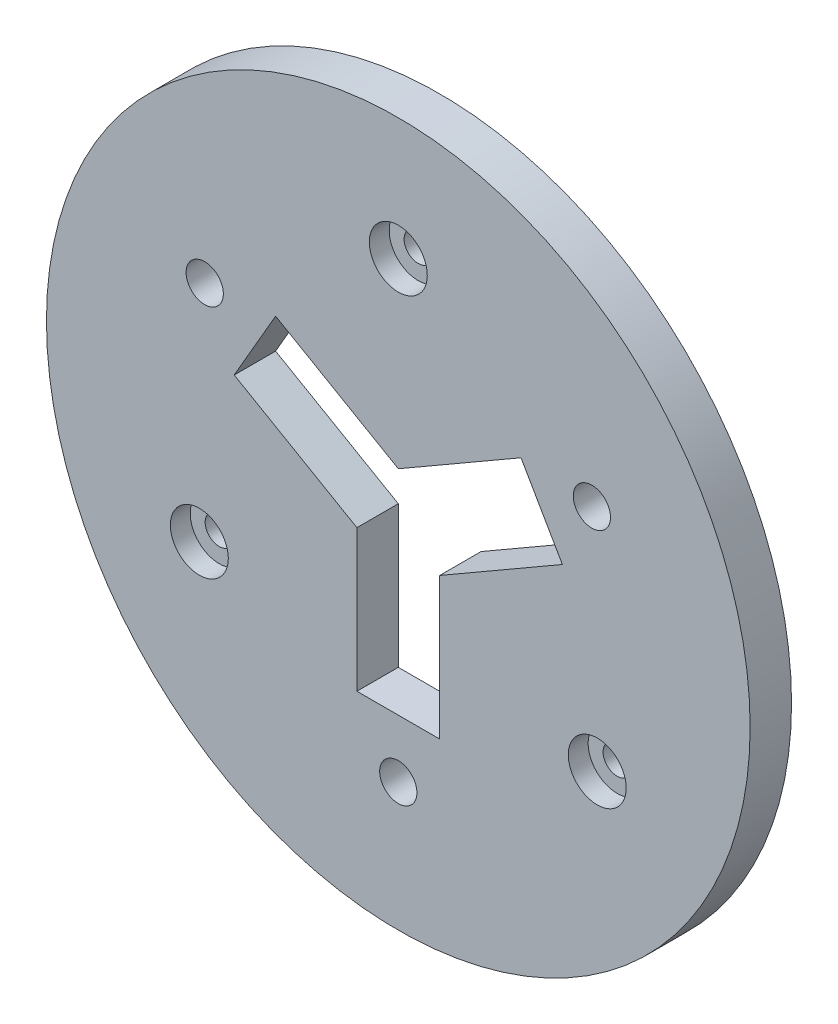
ISO-10303-21;
HEADER;
FILE_DESCRIPTION(('STEP AP214'),'2;1');
FILE_NAME('part.step','',(''),(''),'','','');
FILE_SCHEMA(('AUTOMOTIVE_DESIGN { 1 0 10303 214 1 1 1 1 }'));
ENDSEC;
DATA;
#1=APPLICATION_CONTEXT('core data for automotive mechanical design processes');
#2=APPLICATION_PROTOCOL_DEFINITION('international standard','automotive_design',2000,#1);
#3=PRODUCT_CONTEXT('',#1,'mechanical');
#4=PRODUCT('Part','Part','',(#3));
#5=PRODUCT_RELATED_PRODUCT_CATEGORY('part','',(#4));
#6=PRODUCT_DEFINITION_FORMATION('','',#4);
#7=PRODUCT_DEFINITION_CONTEXT('part definition',#1,'design');
#8=PRODUCT_DEFINITION('design','',#6,#7);
#9=PRODUCT_DEFINITION_SHAPE('','',#8);
#10=(LENGTH_UNIT() NAMED_UNIT(*) SI_UNIT(.MILLI.,.METRE.));
#11=(NAMED_UNIT(*) PLANE_ANGLE_UNIT() SI_UNIT($,.RADIAN.));
#12=(NAMED_UNIT(*) SI_UNIT($,.STERADIAN.) SOLID_ANGLE_UNIT());
#13=UNCERTAINTY_MEASURE_WITH_UNIT(LENGTH_MEASURE(1.E-05),#10,'distance_accuracy_value','');
#14=(GEOMETRIC_REPRESENTATION_CONTEXT(3) GLOBAL_UNCERTAINTY_ASSIGNED_CONTEXT((#13)) GLOBAL_UNIT_ASSIGNED_CONTEXT((#10,
#11,#12)) REPRESENTATION_CONTEXT('',''));
#15=CARTESIAN_POINT('',(0.,0.,0.));
#16=DIRECTION('',(0.,0.,1.));
#17=DIRECTION('',(1.,0.,0.));
#18=AXIS2_PLACEMENT_3D('',#15,#16,#17);
#19=CARTESIAN_POINT('',(0.,0.,2.5));
#20=DIRECTION('',(0.,0.,-1.));
#21=DIRECTION('',(-1.,0.,0.));
#22=AXIS2_PLACEMENT_3D('',#19,#20,#21);
#23=CYLINDRICAL_SURFACE('',#22,42.5);
#24=CARTESIAN_POINT('',(0.,0.,2.5));
#25=DIRECTION('',(0.,0.,1.));
#26=DIRECTION('',(1.,0.,0.));
#27=AXIS2_PLACEMENT_3D('',#24,#25,#26);
#28=CIRCLE('',#27,42.5);
#29=CARTESIAN_POINT('',(42.5,0.,2.5));
#30=VERTEX_POINT('',#29);
#31=EDGE_CURVE('E11',#30,#30,#28,.T.);
#32=ORIENTED_EDGE('',*,*,#31,.F.);
#33=EDGE_LOOP('',(#32));
#34=FACE_BOUND('',#33,.T.);
#35=CARTESIAN_POINT('',(0.,0.,-2.5));
#36=DIRECTION('',(0.,0.,1.));
#37=DIRECTION('',(1.,0.,0.));
#38=AXIS2_PLACEMENT_3D('',#35,#36,#37);
#39=CIRCLE('',#38,42.5);
#40=CARTESIAN_POINT('',(42.5,0.,-2.5));
#41=VERTEX_POINT('',#40);
#42=EDGE_CURVE('E36',#41,#41,#39,.T.);
#43=ORIENTED_EDGE('',*,*,#42,.T.);
#44=EDGE_LOOP('',(#43));
#45=FACE_BOUND('',#44,.T.);
#46=ADVANCED_FACE('F33',(#34,#45),#23,.T.);
#47=CARTESIAN_POINT('',(0.,0.,2.5));
#48=DIRECTION('',(0.,0.,1.));
#49=DIRECTION('',(1.,0.,0.));
#50=AXIS2_PLACEMENT_3D('',#47,#48,#49);
#51=PLANE('',#50);
#52=DIRECTION('',(-0.499999999999998,-0.86602540378444,0.));
#53=VECTOR('',#52,1.);
#54=CARTESIAN_POINT('',(-14.8205080756888,14.3301270189222,2.5));
#55=LINE('',#54,#53);
#56=CARTESIAN_POINT('',(-14.8205080756888,14.3301270189222,2.5));
#57=VERTEX_POINT('',#56);
#58=CARTESIAN_POINT('',(-19.8205080756888,5.66987298107775,2.5));
#59=VERTEX_POINT('',#58);
#60=EDGE_CURVE('E47',#57,#59,#55,.T.);
#61=ORIENTED_EDGE('',*,*,#60,.F.);
#62=DIRECTION('',(-0.86602540378444,0.499999999999998,0.));
#63=VECTOR('',#62,1.);
#64=CARTESIAN_POINT('',(-14.8205080756888,14.3301270189222,2.5));
#65=LINE('',#64,#63);
#66=CARTESIAN_POINT('',(0.,5.77350269189626,2.5));
#67=VERTEX_POINT('',#66);
#68=EDGE_CURVE('E111',#67,#57,#65,.T.);
#69=ORIENTED_EDGE('',*,*,#68,.F.);
#70=DIRECTION('',(-0.866025403784436,-0.500000000000004,0.));
#71=VECTOR('',#70,1.);
#72=CARTESIAN_POINT('',(0.,5.77350269189626,2.5));
#73=LINE('',#72,#71);
#74=CARTESIAN_POINT('',(14.8205080756887,14.3301270189223,2.5));
#75=VERTEX_POINT('',#74);
#76=EDGE_CURVE('E148',#75,#67,#73,.T.);
#77=ORIENTED_EDGE('',*,*,#76,.F.);
#78=DIRECTION('',(-0.500000000000004,0.866025403784436,0.));
#79=VECTOR('',#78,1.);
#80=CARTESIAN_POINT('',(14.8205080756887,14.3301270189223,2.5));
#81=LINE('',#80,#79);
#82=CARTESIAN_POINT('',(19.8205080756887,5.66987298107791,2.5));
#83=VERTEX_POINT('',#82);
#84=EDGE_CURVE('E145',#83,#75,#81,.T.);
#85=ORIENTED_EDGE('',*,*,#84,.F.);
#86=DIRECTION('',(0.866025403784436,0.500000000000004,0.));
#87=VECTOR('',#86,1.);
#88=CARTESIAN_POINT('',(5.,-2.88675134594811,2.5));
#89=LINE('',#88,#87);
#90=CARTESIAN_POINT('',(5.,-2.88675134594811,2.5));
#91=VERTEX_POINT('',#90);
#92=EDGE_CURVE('E142',#91,#83,#89,.T.);
#93=ORIENTED_EDGE('',*,*,#92,.F.);
#94=DIRECTION('',(0.,1.,0.));
#95=VECTOR('',#94,1.);
#96=CARTESIAN_POINT('',(5.,-2.88675134594811,2.5));
#97=LINE('',#96,#95);
#98=CARTESIAN_POINT('',(5.,-20.,2.5));
#99=VERTEX_POINT('',#98);
#100=EDGE_CURVE('E139',#99,#91,#97,.T.);
#101=ORIENTED_EDGE('',*,*,#100,.F.);
#102=DIRECTION('',(1.,0.,0.));
#103=VECTOR('',#102,1.);
#104=CARTESIAN_POINT('',(-5.,-20.,2.5));
#105=LINE('',#104,#103);
#106=CARTESIAN_POINT('',(-5.,-20.,2.5));
#107=VERTEX_POINT('',#106);
#108=EDGE_CURVE('E136',#107,#99,#105,.T.);
#109=ORIENTED_EDGE('',*,*,#108,.F.);
#110=DIRECTION('',(0.,-1.,0.));
#111=VECTOR('',#110,1.);
#112=CARTESIAN_POINT('',(-5.,-2.88675134594813,2.5));
#113=LINE('',#112,#111);
#114=CARTESIAN_POINT('',(-5.,-2.88675134594813,2.5));
#115=VERTEX_POINT('',#114);
#116=EDGE_CURVE('E133',#115,#107,#113,.T.);
#117=ORIENTED_EDGE('',*,*,#116,.F.);
#118=DIRECTION('',(0.86602540378444,-0.499999999999998,0.));
#119=VECTOR('',#118,1.);
#120=CARTESIAN_POINT('',(-19.8205080756888,5.66987298107775,2.5));
#121=LINE('',#120,#119);
#122=EDGE_CURVE('E126',#59,#115,#121,.T.);
#123=ORIENTED_EDGE('',*,*,#122,.F.);
#124=EDGE_LOOP('',(#61,#69,#77,#85,#93,#101,#109,#117,#123));
#125=FACE_BOUND('',#124,.T.);
#126=CARTESIAN_POINT('',(0.,-27.,2.5));
#127=DIRECTION('',(0.,0.,1.));
#128=DIRECTION('',(1.,0.,0.));
#129=AXIS2_PLACEMENT_3D('',#126,#127,#128);
#130=CIRCLE('',#129,2.25);
#131=CARTESIAN_POINT('',(2.25,-27.,2.5));
#132=VERTEX_POINT('',#131);
#133=EDGE_CURVE('E117',#132,#132,#130,.T.);
#134=ORIENTED_EDGE('',*,*,#133,.F.);
#135=EDGE_LOOP('',(#134));
#136=FACE_BOUND('',#135,.T.);
#137=CARTESIAN_POINT('',(-23.3826859021798,13.5,2.5));
#138=DIRECTION('',(0.,0.,1.));
#139=DIRECTION('',(1.,0.,0.));
#140=AXIS2_PLACEMENT_3D('',#137,#138,#139);
#141=CIRCLE('',#140,2.25);
#142=CARTESIAN_POINT('',(-21.1326859021798,13.5,2.5));
#143=VERTEX_POINT('',#142);
#144=EDGE_CURVE('E172',#143,#143,#141,.T.);
#145=ORIENTED_EDGE('',*,*,#144,.F.);
#146=EDGE_LOOP('',(#145));
#147=FACE_BOUND('',#146,.T.);
#148=CARTESIAN_POINT('',(23.3826859021799,13.5,2.5));
#149=DIRECTION('',(0.,0.,1.));
#150=DIRECTION('',(1.,0.,0.));
#151=AXIS2_PLACEMENT_3D('',#148,#149,#150);
#152=CIRCLE('',#151,2.25);
#153=CARTESIAN_POINT('',(25.6326859021799,13.5,2.5));
#154=VERTEX_POINT('',#153);
#155=EDGE_CURVE('E178',#154,#154,#152,.T.);
#156=ORIENTED_EDGE('',*,*,#155,.F.);
#157=EDGE_LOOP('',(#156));
#158=FACE_BOUND('',#157,.T.);
#159=CARTESIAN_POINT('',(0.,27.75,2.5));
#160=DIRECTION('',(0.,0.,1.));
#161=DIRECTION('',(1.,0.,0.));
#162=AXIS2_PLACEMENT_3D('',#159,#160,#161);
#163=CIRCLE('',#162,3.5);
#164=CARTESIAN_POINT('',(3.5,27.75,2.5));
#165=VERTEX_POINT('',#164);
#166=EDGE_CURVE('E184',#165,#165,#163,.T.);
#167=ORIENTED_EDGE('',*,*,#166,.F.);
#168=EDGE_LOOP('',(#167));
#169=FACE_BOUND('',#168,.T.);
#170=CARTESIAN_POINT('',(24.0322049550199,-13.874999999999,2.5));
#171=DIRECTION('',(0.,0.,1.));
#172=DIRECTION('',(1.,0.,0.));
#173=AXIS2_PLACEMENT_3D('',#170,#171,#172);
#174=CIRCLE('',#173,3.5);
#175=CARTESIAN_POINT('',(27.5322049550199,-13.874999999999,2.5));
#176=VERTEX_POINT('',#175);
#177=EDGE_CURVE('E196',#176,#176,#174,.T.);
#178=ORIENTED_EDGE('',*,*,#177,.F.);
#179=EDGE_LOOP('',(#178));
#180=FACE_BOUND('',#179,.T.);
#181=CARTESIAN_POINT('',(-24.0322049550165,-13.875000000001,2.5));
#182=DIRECTION('',(0.,0.,1.));
#183=DIRECTION('',(1.,0.,0.));
#184=AXIS2_PLACEMENT_3D('',#181,#182,#183);
#185=CIRCLE('',#184,3.5);
#186=CARTESIAN_POINT('',(-20.5322049550165,-13.875000000001,2.5));
#187=VERTEX_POINT('',#186);
#188=EDGE_CURVE('E208',#187,#187,#185,.T.);
#189=ORIENTED_EDGE('',*,*,#188,.F.);
#190=EDGE_LOOP('',(#189));
#191=FACE_BOUND('',#190,.T.);
#192=ORIENTED_EDGE('',*,*,#31,.T.);
#193=EDGE_LOOP('',(#192));
#194=FACE_BOUND('',#193,.T.);
#195=ADVANCED_FACE('F227',(#125,#136,#147,#158,#169,#180,#191,#194),#51,.T.);
#196=CARTESIAN_POINT('',(0.,0.,-2.5));
#197=DIRECTION('',(0.,0.,1.));
#198=DIRECTION('',(1.,0.,0.));
#199=AXIS2_PLACEMENT_3D('',#196,#197,#198);
#200=PLANE('',#199);
#201=DIRECTION('',(0.86602540378444,-0.499999999999998,0.));
#202=VECTOR('',#201,1.);
#203=CARTESIAN_POINT('',(-14.8205080756888,14.3301270189222,-2.5));
#204=LINE('',#203,#202);
#205=CARTESIAN_POINT('',(-14.8205080756888,14.3301270189222,-2.5));
#206=VERTEX_POINT('',#205);
#207=CARTESIAN_POINT('',(0.,5.77350269189626,-2.5));
#208=VERTEX_POINT('',#207);
#209=EDGE_CURVE('E124',#206,#208,#204,.T.);
#210=ORIENTED_EDGE('',*,*,#209,.F.);
#211=DIRECTION('',(0.499999999999998,0.86602540378444,0.));
#212=VECTOR('',#211,1.);
#213=CARTESIAN_POINT('',(-14.8205080756888,14.3301270189222,-2.5));
#214=LINE('',#213,#212);
#215=CARTESIAN_POINT('',(-19.8205080756888,5.66987298107775,-2.5));
#216=VERTEX_POINT('',#215);
#217=EDGE_CURVE('E105',#216,#206,#214,.T.);
#218=ORIENTED_EDGE('',*,*,#217,.F.);
#219=DIRECTION('',(-0.86602540378444,0.499999999999998,0.));
#220=VECTOR('',#219,1.);
#221=CARTESIAN_POINT('',(-19.8205080756888,5.66987298107775,-2.5));
#222=LINE('',#221,#220);
#223=CARTESIAN_POINT('',(-5.,-2.88675134594813,-2.5));
#224=VERTEX_POINT('',#223);
#225=EDGE_CURVE('E114',#224,#216,#222,.T.);
#226=ORIENTED_EDGE('',*,*,#225,.F.);
#227=DIRECTION('',(0.,1.,0.));
#228=VECTOR('',#227,1.);
#229=CARTESIAN_POINT('',(-5.,-2.88675134594813,-2.5));
#230=LINE('',#229,#228);
#231=CARTESIAN_POINT('',(-5.,-20.,-2.5));
#232=VERTEX_POINT('',#231);
#233=EDGE_CURVE('E55',#232,#224,#230,.T.);
#234=ORIENTED_EDGE('',*,*,#233,.F.);
#235=DIRECTION('',(-1.,0.,0.));
#236=VECTOR('',#235,1.);
#237=CARTESIAN_POINT('',(-5.,-20.,-2.5));
#238=LINE('',#237,#236);
#239=CARTESIAN_POINT('',(5.,-20.,-2.5));
#240=VERTEX_POINT('',#239);
#241=EDGE_CURVE('E496',#240,#232,#238,.T.);
#242=ORIENTED_EDGE('',*,*,#241,.F.);
#243=DIRECTION('',(0.,-1.,0.));
#244=VECTOR('',#243,1.);
#245=CARTESIAN_POINT('',(5.,-2.88675134594811,-2.5));
#246=LINE('',#245,#244);
#247=CARTESIAN_POINT('',(5.,-2.88675134594811,-2.5));
#248=VERTEX_POINT('',#247);
#249=EDGE_CURVE('E499',#248,#240,#246,.T.);
#250=ORIENTED_EDGE('',*,*,#249,.F.);
#251=DIRECTION('',(-0.866025403784436,-0.500000000000004,0.));
#252=VECTOR('',#251,1.);
#253=CARTESIAN_POINT('',(5.,-2.88675134594811,-2.5));
#254=LINE('',#253,#252);
#255=CARTESIAN_POINT('',(19.8205080756887,5.66987298107791,-2.5));
#256=VERTEX_POINT('',#255);
#257=EDGE_CURVE('E504',#256,#248,#254,.T.);
#258=ORIENTED_EDGE('',*,*,#257,.F.);
#259=DIRECTION('',(0.500000000000004,-0.866025403784436,0.));
#260=VECTOR('',#259,1.);
#261=CARTESIAN_POINT('',(14.8205080756887,14.3301270189223,-2.5));
#262=LINE('',#261,#260);
#263=CARTESIAN_POINT('',(14.8205080756887,14.3301270189223,-2.5));
#264=VERTEX_POINT('',#263);
#265=EDGE_CURVE('E507',#264,#256,#262,.T.);
#266=ORIENTED_EDGE('',*,*,#265,.F.);
#267=DIRECTION('',(0.866025403784436,0.500000000000004,0.));
#268=VECTOR('',#267,1.);
#269=CARTESIAN_POINT('',(0.,5.77350269189626,-2.5));
#270=LINE('',#269,#268);
#271=EDGE_CURVE('E128',#208,#264,#270,.T.);
#272=ORIENTED_EDGE('',*,*,#271,.F.);
#273=EDGE_LOOP('',(#210,#218,#226,#234,#242,#250,#258,#266,#272));
#274=FACE_BOUND('',#273,.T.);
#275=CARTESIAN_POINT('',(0.,-27.,-2.5));
#276=DIRECTION('',(0.,0.,1.));
#277=DIRECTION('',(1.,0.,0.));
#278=AXIS2_PLACEMENT_3D('',#275,#276,#277);
#279=CIRCLE('',#278,2.25);
#280=CARTESIAN_POINT('',(2.25,-27.,-2.5));
#281=VERTEX_POINT('',#280);
#282=EDGE_CURVE('E169',#281,#281,#279,.T.);
#283=ORIENTED_EDGE('',*,*,#282,.T.);
#284=EDGE_LOOP('',(#283));
#285=FACE_BOUND('',#284,.T.);
#286=CARTESIAN_POINT('',(-23.3826859021798,13.5,-2.5));
#287=DIRECTION('',(0.,0.,1.));
#288=DIRECTION('',(1.,0.,0.));
#289=AXIS2_PLACEMENT_3D('',#286,#287,#288);
#290=CIRCLE('',#289,2.25);
#291=CARTESIAN_POINT('',(-21.1326859021798,13.5,-2.5));
#292=VERTEX_POINT('',#291);
#293=EDGE_CURVE('E175',#292,#292,#290,.T.);
#294=ORIENTED_EDGE('',*,*,#293,.T.);
#295=EDGE_LOOP('',(#294));
#296=FACE_BOUND('',#295,.T.);
#297=CARTESIAN_POINT('',(23.3826859021799,13.5,-2.5));
#298=DIRECTION('',(0.,0.,1.));
#299=DIRECTION('',(1.,0.,0.));
#300=AXIS2_PLACEMENT_3D('',#297,#298,#299);
#301=CIRCLE('',#300,2.25);
#302=CARTESIAN_POINT('',(25.6326859021799,13.5,-2.5));
#303=VERTEX_POINT('',#302);
#304=EDGE_CURVE('E181',#303,#303,#301,.T.);
#305=ORIENTED_EDGE('',*,*,#304,.T.);
#306=EDGE_LOOP('',(#305));
#307=FACE_BOUND('',#306,.T.);
#308=CARTESIAN_POINT('',(0.,27.75,-2.5));
#309=DIRECTION('',(0.,0.,1.));
#310=DIRECTION('',(1.,0.,0.));
#311=AXIS2_PLACEMENT_3D('',#308,#309,#310);
#312=CIRCLE('',#311,1.7);
#313=CARTESIAN_POINT('',(1.7,27.75,-2.5));
#314=VERTEX_POINT('',#313);
#315=EDGE_CURVE('E193',#314,#314,#312,.T.);
#316=ORIENTED_EDGE('',*,*,#315,.T.);
#317=EDGE_LOOP('',(#316));
#318=FACE_BOUND('',#317,.T.);
#319=CARTESIAN_POINT('',(24.0322049550199,-13.874999999999,-2.5));
#320=DIRECTION('',(0.,0.,1.));
#321=DIRECTION('',(1.,0.,0.));
#322=AXIS2_PLACEMENT_3D('',#319,#320,#321);
#323=CIRCLE('',#322,1.7);
#324=CARTESIAN_POINT('',(25.7322049550199,-13.874999999999,-2.5));
#325=VERTEX_POINT('',#324);
#326=EDGE_CURVE('E205',#325,#325,#323,.T.);
#327=ORIENTED_EDGE('',*,*,#326,.T.);
#328=EDGE_LOOP('',(#327));
#329=FACE_BOUND('',#328,.T.);
#330=CARTESIAN_POINT('',(-24.0322049550165,-13.875000000001,-2.5));
#331=DIRECTION('',(0.,0.,1.));
#332=DIRECTION('',(1.,0.,0.));
#333=AXIS2_PLACEMENT_3D('',#330,#331,#332);
#334=CIRCLE('',#333,1.7);
#335=CARTESIAN_POINT('',(-22.3322049550165,-13.875000000001,-2.5));
#336=VERTEX_POINT('',#335);
#337=EDGE_CURVE('E217',#336,#336,#334,.T.);
#338=ORIENTED_EDGE('',*,*,#337,.T.);
#339=EDGE_LOOP('',(#338));
#340=FACE_BOUND('',#339,.T.);
#341=ORIENTED_EDGE('',*,*,#42,.F.);
#342=EDGE_LOOP('',(#341));
#343=FACE_BOUND('',#342,.T.);
#344=ADVANCED_FACE('F120',(#274,#285,#296,#307,#318,#329,#340,#343),#200,.F.);
#345=CARTESIAN_POINT('',(-24.0322049550165,-13.875000000001,2.5));
#346=DIRECTION('',(0.,0.,1.));
#347=DIRECTION('',(1.,0.,0.));
#348=AXIS2_PLACEMENT_3D('',#345,#346,#347);
#349=CYLINDRICAL_SURFACE('',#348,1.7);
#350=ORIENTED_EDGE('',*,*,#337,.F.);
#351=EDGE_LOOP('',(#350));
#352=FACE_BOUND('',#351,.T.);
#353=CARTESIAN_POINT('',(-24.0322049550165,-13.875000000001,0.100000000000001));
#354=DIRECTION('',(0.,0.,1.));
#355=DIRECTION('',(1.,0.,0.));
#356=AXIS2_PLACEMENT_3D('',#353,#354,#355);
#357=CIRCLE('',#356,1.7);
#358=CARTESIAN_POINT('',(-22.3322049550165,-13.875000000001,0.100000000000001));
#359=VERTEX_POINT('',#358);
#360=EDGE_CURVE('E214',#359,#359,#357,.T.);
#361=ORIENTED_EDGE('',*,*,#360,.T.);
#362=EDGE_LOOP('',(#361));
#363=FACE_BOUND('',#362,.T.);
#364=ADVANCED_FACE('F226',(#352,#363),#349,.F.);
#365=CARTESIAN_POINT('',(-22.3322049550165,-13.875000000001,0.100000000000001));
#366=DIRECTION('',(0.,0.,-1.));
#367=DIRECTION('',(-1.,0.,0.));
#368=AXIS2_PLACEMENT_3D('',#365,#366,#367);
#369=PLANE('',#368);
#370=ORIENTED_EDGE('',*,*,#360,.F.);
#371=EDGE_LOOP('',(#370));
#372=FACE_BOUND('',#371,.T.);
#373=CARTESIAN_POINT('',(-24.0322049550165,-13.875000000001,0.100000000000001));
#374=DIRECTION('',(0.,0.,1.));
#375=DIRECTION('',(1.,0.,0.));
#376=AXIS2_PLACEMENT_3D('',#373,#374,#375);
#377=CIRCLE('',#376,3.5);
#378=CARTESIAN_POINT('',(-20.5322049550165,-13.875000000001,0.100000000000001));
#379=VERTEX_POINT('',#378);
#380=EDGE_CURVE('E211',#379,#379,#377,.T.);
#381=ORIENTED_EDGE('',*,*,#380,.T.);
#382=EDGE_LOOP('',(#381));
#383=FACE_BOUND('',#382,.T.);
#384=ADVANCED_FACE('F232',(#372,#383),#369,.F.);
#385=CARTESIAN_POINT('',(-24.0322049550165,-13.875000000001,2.5));
#386=DIRECTION('',(0.,0.,1.));
#387=DIRECTION('',(1.,0.,0.));
#388=AXIS2_PLACEMENT_3D('',#385,#386,#387);
#389=CYLINDRICAL_SURFACE('',#388,3.5);
#390=ORIENTED_EDGE('',*,*,#380,.F.);
#391=EDGE_LOOP('',(#390));
#392=FACE_BOUND('',#391,.T.);
#393=ORIENTED_EDGE('',*,*,#188,.T.);
#394=EDGE_LOOP('',(#393));
#395=FACE_BOUND('',#394,.T.);
#396=ADVANCED_FACE('F382',(#392,#395),#389,.F.);
#397=CARTESIAN_POINT('',(24.0322049550199,-13.874999999999,2.5));
#398=DIRECTION('',(0.,0.,1.));
#399=DIRECTION('',(1.,0.,0.));
#400=AXIS2_PLACEMENT_3D('',#397,#398,#399);
#401=CYLINDRICAL_SURFACE('',#400,1.7);
#402=ORIENTED_EDGE('',*,*,#326,.F.);
#403=EDGE_LOOP('',(#402));
#404=FACE_BOUND('',#403,.T.);
#405=CARTESIAN_POINT('',(24.0322049550199,-13.874999999999,0.100000000000001));
#406=DIRECTION('',(0.,0.,1.));
#407=DIRECTION('',(1.,0.,0.));
#408=AXIS2_PLACEMENT_3D('',#405,#406,#407);
#409=CIRCLE('',#408,1.7);
#410=CARTESIAN_POINT('',(25.7322049550199,-13.874999999999,0.100000000000001));
#411=VERTEX_POINT('',#410);
#412=EDGE_CURVE('E202',#411,#411,#409,.T.);
#413=ORIENTED_EDGE('',*,*,#412,.T.);
#414=EDGE_LOOP('',(#413));
#415=FACE_BOUND('',#414,.T.);
#416=ADVANCED_FACE('F378',(#404,#415),#401,.F.);
#417=CARTESIAN_POINT('',(25.7322049550199,-13.874999999999,0.100000000000001));
#418=DIRECTION('',(0.,0.,-1.));
#419=DIRECTION('',(-1.,0.,0.));
#420=AXIS2_PLACEMENT_3D('',#417,#418,#419);
#421=PLANE('',#420);
#422=ORIENTED_EDGE('',*,*,#412,.F.);
#423=EDGE_LOOP('',(#422));
#424=FACE_BOUND('',#423,.T.);
#425=CARTESIAN_POINT('',(24.0322049550199,-13.874999999999,0.100000000000001));
#426=DIRECTION('',(0.,0.,1.));
#427=DIRECTION('',(1.,0.,0.));
#428=AXIS2_PLACEMENT_3D('',#425,#426,#427);
#429=CIRCLE('',#428,3.5);
#430=CARTESIAN_POINT('',(27.5322049550199,-13.874999999999,0.100000000000001));
#431=VERTEX_POINT('',#430);
#432=EDGE_CURVE('E199',#431,#431,#429,.T.);
#433=ORIENTED_EDGE('',*,*,#432,.T.);
#434=EDGE_LOOP('',(#433));
#435=FACE_BOUND('',#434,.T.);
#436=ADVANCED_FACE('F374',(#424,#435),#421,.F.);
#437=CARTESIAN_POINT('',(24.0322049550199,-13.874999999999,2.5));
#438=DIRECTION('',(0.,0.,1.));
#439=DIRECTION('',(1.,0.,0.));
#440=AXIS2_PLACEMENT_3D('',#437,#438,#439);
#441=CYLINDRICAL_SURFACE('',#440,3.5);
#442=ORIENTED_EDGE('',*,*,#432,.F.);
#443=EDGE_LOOP('',(#442));
#444=FACE_BOUND('',#443,.T.);
#445=ORIENTED_EDGE('',*,*,#177,.T.);
#446=EDGE_LOOP('',(#445));
#447=FACE_BOUND('',#446,.T.);
#448=ADVANCED_FACE('F370',(#444,#447),#441,.F.);
#449=CARTESIAN_POINT('',(0.,27.75,2.5));
#450=DIRECTION('',(0.,0.,1.));
#451=DIRECTION('',(1.,0.,0.));
#452=AXIS2_PLACEMENT_3D('',#449,#450,#451);
#453=CYLINDRICAL_SURFACE('',#452,1.7);
#454=ORIENTED_EDGE('',*,*,#315,.F.);
#455=EDGE_LOOP('',(#454));
#456=FACE_BOUND('',#455,.T.);
#457=CARTESIAN_POINT('',(0.,27.75,0.100000000000001));
#458=DIRECTION('',(0.,0.,1.));
#459=DIRECTION('',(1.,0.,0.));
#460=AXIS2_PLACEMENT_3D('',#457,#458,#459);
#461=CIRCLE('',#460,1.7);
#462=CARTESIAN_POINT('',(1.7,27.75,0.100000000000001));
#463=VERTEX_POINT('',#462);
#464=EDGE_CURVE('E190',#463,#463,#461,.T.);
#465=ORIENTED_EDGE('',*,*,#464,.T.);
#466=EDGE_LOOP('',(#465));
#467=FACE_BOUND('',#466,.T.);
#468=ADVANCED_FACE('F366',(#456,#467),#453,.F.);
#469=CARTESIAN_POINT('',(1.7,27.75,0.100000000000001));
#470=DIRECTION('',(0.,0.,-1.));
#471=DIRECTION('',(-1.,0.,0.));
#472=AXIS2_PLACEMENT_3D('',#469,#470,#471);
#473=PLANE('',#472);
#474=ORIENTED_EDGE('',*,*,#464,.F.);
#475=EDGE_LOOP('',(#474));
#476=FACE_BOUND('',#475,.T.);
#477=CARTESIAN_POINT('',(0.,27.75,0.100000000000001));
#478=DIRECTION('',(0.,0.,1.));
#479=DIRECTION('',(1.,0.,0.));
#480=AXIS2_PLACEMENT_3D('',#477,#478,#479);
#481=CIRCLE('',#480,3.5);
#482=CARTESIAN_POINT('',(3.5,27.75,0.100000000000001));
#483=VERTEX_POINT('',#482);
#484=EDGE_CURVE('E187',#483,#483,#481,.T.);
#485=ORIENTED_EDGE('',*,*,#484,.T.);
#486=EDGE_LOOP('',(#485));
#487=FACE_BOUND('',#486,.T.);
#488=ADVANCED_FACE('F362',(#476,#487),#473,.F.);
#489=CARTESIAN_POINT('',(0.,27.75,2.5));
#490=DIRECTION('',(0.,0.,1.));
#491=DIRECTION('',(1.,0.,0.));
#492=AXIS2_PLACEMENT_3D('',#489,#490,#491);
#493=CYLINDRICAL_SURFACE('',#492,3.5);
#494=ORIENTED_EDGE('',*,*,#484,.F.);
#495=EDGE_LOOP('',(#494));
#496=FACE_BOUND('',#495,.T.);
#497=ORIENTED_EDGE('',*,*,#166,.T.);
#498=EDGE_LOOP('',(#497));
#499=FACE_BOUND('',#498,.T.);
#500=ADVANCED_FACE('F358',(#496,#499),#493,.F.);
#501=CARTESIAN_POINT('',(23.3826859021799,13.5,2.5));
#502=DIRECTION('',(0.,0.,1.));
#503=DIRECTION('',(1.,0.,0.));
#504=AXIS2_PLACEMENT_3D('',#501,#502,#503);
#505=CYLINDRICAL_SURFACE('',#504,2.25);
#506=ORIENTED_EDGE('',*,*,#304,.F.);
#507=EDGE_LOOP('',(#506));
#508=FACE_BOUND('',#507,.T.);
#509=ORIENTED_EDGE('',*,*,#155,.T.);
#510=EDGE_LOOP('',(#509));
#511=FACE_BOUND('',#510,.T.);
#512=ADVANCED_FACE('F354',(#508,#511),#505,.F.);
#513=CARTESIAN_POINT('',(-23.3826859021798,13.5,2.5));
#514=DIRECTION('',(0.,0.,1.));
#515=DIRECTION('',(1.,0.,0.));
#516=AXIS2_PLACEMENT_3D('',#513,#514,#515);
#517=CYLINDRICAL_SURFACE('',#516,2.25);
#518=ORIENTED_EDGE('',*,*,#293,.F.);
#519=EDGE_LOOP('',(#518));
#520=FACE_BOUND('',#519,.T.);
#521=ORIENTED_EDGE('',*,*,#144,.T.);
#522=EDGE_LOOP('',(#521));
#523=FACE_BOUND('',#522,.T.);
#524=ADVANCED_FACE('F350',(#520,#523),#517,.F.);
#525=CARTESIAN_POINT('',(0.,-27.,2.5));
#526=DIRECTION('',(0.,0.,1.));
#527=DIRECTION('',(1.,0.,0.));
#528=AXIS2_PLACEMENT_3D('',#525,#526,#527);
#529=CYLINDRICAL_SURFACE('',#528,2.25);
#530=ORIENTED_EDGE('',*,*,#282,.F.);
#531=EDGE_LOOP('',(#530));
#532=FACE_BOUND('',#531,.T.);
#533=ORIENTED_EDGE('',*,*,#133,.T.);
#534=EDGE_LOOP('',(#533));
#535=FACE_BOUND('',#534,.T.);
#536=ADVANCED_FACE('F254',(#532,#535),#529,.F.);
#537=CARTESIAN_POINT('',(-14.8205080756888,14.3301270189222,-2.501));
#538=DIRECTION('',(-0.86602540378444,0.499999999999998,0.));
#539=DIRECTION('',(-0.499999999999998,-0.86602540378444,0.));
#540=AXIS2_PLACEMENT_3D('',#537,#538,#539);
#541=PLANE('',#540);
#542=ORIENTED_EDGE('',*,*,#217,.T.);
#543=DIRECTION('',(0.,0.,1.));
#544=VECTOR('',#543,1.);
#545=CARTESIAN_POINT('',(-14.8205080756888,14.3301270189222,-2.501));
#546=LINE('',#545,#544);
#547=EDGE_CURVE('E118',#206,#57,#546,.T.);
#548=ORIENTED_EDGE('',*,*,#547,.T.);
#549=ORIENTED_EDGE('',*,*,#60,.T.);
#550=DIRECTION('',(0.,0.,1.));
#551=VECTOR('',#550,1.);
#552=CARTESIAN_POINT('',(-19.8205080756888,5.66987298107775,-2.501));
#553=LINE('',#552,#551);
#554=EDGE_CURVE('E101',#216,#59,#553,.T.);
#555=ORIENTED_EDGE('',*,*,#554,.F.);
#556=EDGE_LOOP('',(#542,#548,#549,#555));
#557=FACE_BOUND('',#556,.T.);
#558=ADVANCED_FACE('F103',(#557),#541,.F.);
#559=CARTESIAN_POINT('',(-14.8205080756888,14.3301270189222,-2.501));
#560=DIRECTION('',(0.499999999999998,0.86602540378444,0.));
#561=DIRECTION('',(-0.86602540378444,0.499999999999998,0.));
#562=AXIS2_PLACEMENT_3D('',#559,#560,#561);
#563=PLANE('',#562);
#564=ORIENTED_EDGE('',*,*,#209,.T.);
#565=DIRECTION('',(0.,0.,1.));
#566=VECTOR('',#565,1.);
#567=CARTESIAN_POINT('',(0.,5.77350269189626,-2.501));
#568=LINE('',#567,#566);
#569=EDGE_CURVE('E154',#208,#67,#568,.T.);
#570=ORIENTED_EDGE('',*,*,#569,.T.);
#571=ORIENTED_EDGE('',*,*,#68,.T.);
#572=ORIENTED_EDGE('',*,*,#547,.F.);
#573=EDGE_LOOP('',(#564,#570,#571,#572));
#574=FACE_BOUND('',#573,.T.);
#575=ADVANCED_FACE('F268',(#574),#563,.F.);
#576=CARTESIAN_POINT('',(0.,5.77350269189626,-2.501));
#577=DIRECTION('',(-0.500000000000004,0.866025403784436,0.));
#578=DIRECTION('',(-0.866025403784436,-0.500000000000004,0.));
#579=AXIS2_PLACEMENT_3D('',#576,#577,#578);
#580=PLANE('',#579);
#581=ORIENTED_EDGE('',*,*,#271,.T.);
#582=DIRECTION('',(0.,0.,1.));
#583=VECTOR('',#582,1.);
#584=CARTESIAN_POINT('',(14.8205080756887,14.3301270189223,-2.501));
#585=LINE('',#584,#583);
#586=EDGE_CURVE('E156',#264,#75,#585,.T.);
#587=ORIENTED_EDGE('',*,*,#586,.T.);
#588=ORIENTED_EDGE('',*,*,#76,.T.);
#589=ORIENTED_EDGE('',*,*,#569,.F.);
#590=EDGE_LOOP('',(#581,#587,#588,#589));
#591=FACE_BOUND('',#590,.T.);
#592=ADVANCED_FACE('F277',(#591),#580,.F.);
#593=CARTESIAN_POINT('',(14.8205080756887,14.3301270189223,-2.501));
#594=DIRECTION('',(0.866025403784436,0.500000000000004,0.));
#595=DIRECTION('',(-0.500000000000004,0.866025403784436,0.));
#596=AXIS2_PLACEMENT_3D('',#593,#594,#595);
#597=PLANE('',#596);
#598=ORIENTED_EDGE('',*,*,#265,.T.);
#599=DIRECTION('',(0.,0.,1.));
#600=VECTOR('',#599,1.);
#601=CARTESIAN_POINT('',(19.8205080756887,5.66987298107791,-2.501));
#602=LINE('',#601,#600);
#603=EDGE_CURVE('E158',#256,#83,#602,.T.);
#604=ORIENTED_EDGE('',*,*,#603,.T.);
#605=ORIENTED_EDGE('',*,*,#84,.T.);
#606=ORIENTED_EDGE('',*,*,#586,.F.);
#607=EDGE_LOOP('',(#598,#604,#605,#606));
#608=FACE_BOUND('',#607,.T.);
#609=ADVANCED_FACE('F287',(#608),#597,.F.);
#610=CARTESIAN_POINT('',(5.,-2.88675134594811,-2.501));
#611=DIRECTION('',(0.500000000000004,-0.866025403784436,0.));
#612=DIRECTION('',(0.866025403784436,0.500000000000004,0.));
#613=AXIS2_PLACEMENT_3D('',#610,#611,#612);
#614=PLANE('',#613);
#615=ORIENTED_EDGE('',*,*,#257,.T.);
#616=DIRECTION('',(0.,0.,1.));
#617=VECTOR('',#616,1.);
#618=CARTESIAN_POINT('',(5.,-2.88675134594811,-2.501));
#619=LINE('',#618,#617);
#620=EDGE_CURVE('E160',#248,#91,#619,.T.);
#621=ORIENTED_EDGE('',*,*,#620,.T.);
#622=ORIENTED_EDGE('',*,*,#92,.T.);
#623=ORIENTED_EDGE('',*,*,#603,.F.);
#624=EDGE_LOOP('',(#615,#621,#622,#623));
#625=FACE_BOUND('',#624,.T.);
#626=ADVANCED_FACE('F297',(#625),#614,.F.);
#627=CARTESIAN_POINT('',(5.,-2.88675134594811,-2.501));
#628=DIRECTION('',(1.,0.,0.));
#629=DIRECTION('',(0.,1.,0.));
#630=AXIS2_PLACEMENT_3D('',#627,#628,#629);
#631=PLANE('',#630);
#632=ORIENTED_EDGE('',*,*,#249,.T.);
#633=DIRECTION('',(0.,0.,1.));
#634=VECTOR('',#633,1.);
#635=CARTESIAN_POINT('',(5.,-20.,-2.501));
#636=LINE('',#635,#634);
#637=EDGE_CURVE('E162',#240,#99,#636,.T.);
#638=ORIENTED_EDGE('',*,*,#637,.T.);
#639=ORIENTED_EDGE('',*,*,#100,.T.);
#640=ORIENTED_EDGE('',*,*,#620,.F.);
#641=EDGE_LOOP('',(#632,#638,#639,#640));
#642=FACE_BOUND('',#641,.T.);
#643=ADVANCED_FACE('F307',(#642),#631,.F.);
#644=CARTESIAN_POINT('',(-5.,-20.,-2.501));
#645=DIRECTION('',(0.,-1.,0.));
#646=DIRECTION('',(0.,0.,-1.));
#647=AXIS2_PLACEMENT_3D('',#644,#645,#646);
#648=PLANE('',#647);
#649=ORIENTED_EDGE('',*,*,#241,.T.);
#650=DIRECTION('',(0.,0.,1.));
#651=VECTOR('',#650,1.);
#652=CARTESIAN_POINT('',(-5.,-20.,-2.501));
#653=LINE('',#652,#651);
#654=EDGE_CURVE('E164',#232,#107,#653,.T.);
#655=ORIENTED_EDGE('',*,*,#654,.T.);
#656=ORIENTED_EDGE('',*,*,#108,.T.);
#657=ORIENTED_EDGE('',*,*,#637,.F.);
#658=EDGE_LOOP('',(#649,#655,#656,#657));
#659=FACE_BOUND('',#658,.T.);
#660=ADVANCED_FACE('F317',(#659),#648,.F.);
#661=CARTESIAN_POINT('',(-5.,-2.88675134594813,-2.501));
#662=DIRECTION('',(-1.,0.,0.));
#663=DIRECTION('',(0.,-1.,0.));
#664=AXIS2_PLACEMENT_3D('',#661,#662,#663);
#665=PLANE('',#664);
#666=ORIENTED_EDGE('',*,*,#233,.T.);
#667=DIRECTION('',(0.,0.,1.));
#668=VECTOR('',#667,1.);
#669=CARTESIAN_POINT('',(-5.,-2.88675134594813,-2.501));
#670=LINE('',#669,#668);
#671=EDGE_CURVE('E110',#224,#115,#670,.T.);
#672=ORIENTED_EDGE('',*,*,#671,.T.);
#673=ORIENTED_EDGE('',*,*,#116,.T.);
#674=ORIENTED_EDGE('',*,*,#654,.F.);
#675=EDGE_LOOP('',(#666,#672,#673,#674));
#676=FACE_BOUND('',#675,.T.);
#677=ADVANCED_FACE('F327',(#676),#665,.F.);
#678=CARTESIAN_POINT('',(-19.8205080756888,5.66987298107775,-2.501));
#679=DIRECTION('',(-0.499999999999998,-0.86602540378444,0.));
#680=DIRECTION('',(0.86602540378444,-0.499999999999998,0.));
#681=AXIS2_PLACEMENT_3D('',#678,#679,#680);
#682=PLANE('',#681);
#683=ORIENTED_EDGE('',*,*,#225,.T.);
#684=ORIENTED_EDGE('',*,*,#554,.T.);
#685=ORIENTED_EDGE('',*,*,#122,.T.);
#686=ORIENTED_EDGE('',*,*,#671,.F.);
#687=EDGE_LOOP('',(#683,#684,#685,#686));
#688=FACE_BOUND('',#687,.T.);
#689=ADVANCED_FACE('F115',(#688),#682,.F.);
#690=CLOSED_SHELL('',(#46,#195,#344,#364,#384,#396,#416,#436,#448,#468,#488,#500,#512,#524,#536,
#558,#575,#592,#609,#626,#643,#660,#677,#689));
#691=MANIFOLD_SOLID_BREP('B2',#690);
#692=ADVANCED_BREP_SHAPE_REPRESENTATION('',(#18,#691),#14);
#693=SHAPE_DEFINITION_REPRESENTATION(#9,#692);
ENDSEC;
END-ISO-10303-21;
